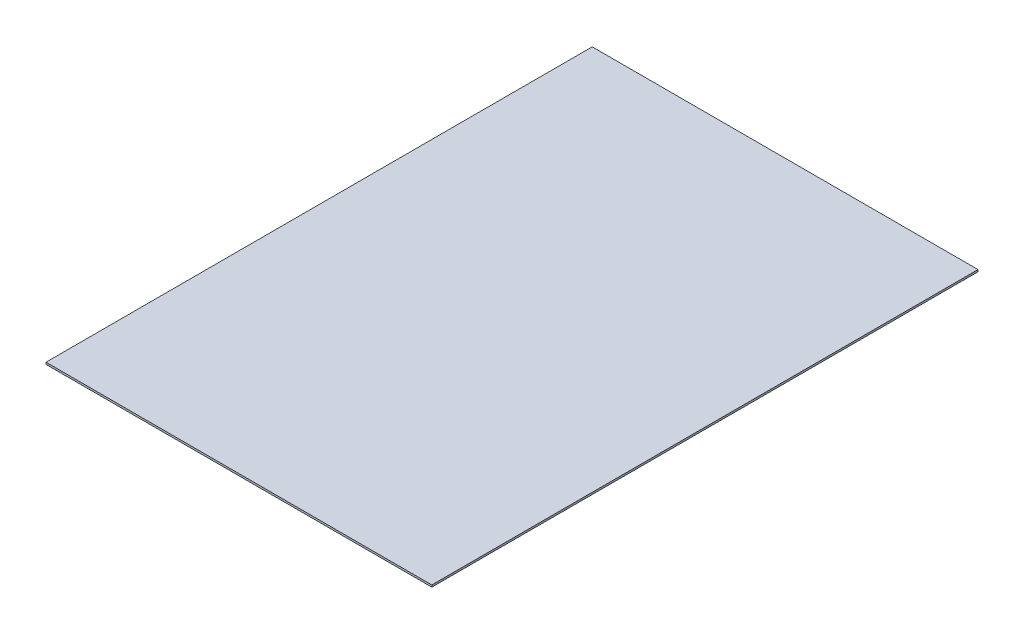
ISO-10303-21;
HEADER;
FILE_DESCRIPTION(('STEP AP214'),'2;1');
FILE_NAME('part.step','',(''),(''),'','','');
FILE_SCHEMA(('AUTOMOTIVE_DESIGN { 1 0 10303 214 1 1 1 1 }'));
ENDSEC;
DATA;
#1=APPLICATION_CONTEXT('core data for automotive mechanical design processes');
#2=APPLICATION_PROTOCOL_DEFINITION('international standard','automotive_design',2000,#1);
#3=PRODUCT_CONTEXT('',#1,'mechanical');
#4=PRODUCT('Part','Part','',(#3));
#5=PRODUCT_RELATED_PRODUCT_CATEGORY('part','',(#4));
#6=PRODUCT_DEFINITION_FORMATION('','',#4);
#7=PRODUCT_DEFINITION_CONTEXT('part definition',#1,'design');
#8=PRODUCT_DEFINITION('design','',#6,#7);
#9=PRODUCT_DEFINITION_SHAPE('','',#8);
#10=(LENGTH_UNIT() NAMED_UNIT(*) SI_UNIT(.MILLI.,.METRE.));
#11=(NAMED_UNIT(*) PLANE_ANGLE_UNIT() SI_UNIT($,.RADIAN.));
#12=(NAMED_UNIT(*) SI_UNIT($,.STERADIAN.) SOLID_ANGLE_UNIT());
#13=UNCERTAINTY_MEASURE_WITH_UNIT(LENGTH_MEASURE(1.E-05),#10,'distance_accuracy_value','');
#14=(GEOMETRIC_REPRESENTATION_CONTEXT(3) GLOBAL_UNCERTAINTY_ASSIGNED_CONTEXT((#13)) GLOBAL_UNIT_ASSIGNED_CONTEXT((#10,
#11,#12)) REPRESENTATION_CONTEXT('',''));
#15=CARTESIAN_POINT('',(0.,0.,0.));
#16=DIRECTION('',(0.,0.,1.));
#17=DIRECTION('',(1.,0.,0.));
#18=AXIS2_PLACEMENT_3D('',#15,#16,#17);
#19=CARTESIAN_POINT('',(297.,3.,420.5));
#20=DIRECTION('',(-1.,0.,0.));
#21=DIRECTION('',(0.,0.,1.));
#22=AXIS2_PLACEMENT_3D('',#19,#20,#21);
#23=PLANE('',#22);
#24=DIRECTION('',(0.,0.,-1.));
#25=VECTOR('',#24,1.);
#26=CARTESIAN_POINT('',(297.,0.,420.5));
#27=LINE('',#26,#25);
#28=CARTESIAN_POINT('',(297.,0.,420.5));
#29=VERTEX_POINT('',#28);
#30=CARTESIAN_POINT('',(297.,0.,-420.5));
#31=VERTEX_POINT('',#30);
#32=EDGE_CURVE('E96',#29,#31,#27,.T.);
#33=ORIENTED_EDGE('',*,*,#32,.T.);
#34=DIRECTION('',(0.,-1.,0.));
#35=VECTOR('',#34,1.);
#36=CARTESIAN_POINT('',(297.,3.,-420.5));
#37=LINE('',#36,#35);
#38=CARTESIAN_POINT('',(297.,3.,-420.5));
#39=VERTEX_POINT('',#38);
#40=EDGE_CURVE('E11',#39,#31,#37,.T.);
#41=ORIENTED_EDGE('',*,*,#40,.F.);
#42=DIRECTION('',(0.,0.,-1.));
#43=VECTOR('',#42,1.);
#44=CARTESIAN_POINT('',(297.,3.,420.5));
#45=LINE('',#44,#43);
#46=CARTESIAN_POINT('',(297.,3.,420.5));
#47=VERTEX_POINT('',#46);
#48=EDGE_CURVE('E84',#47,#39,#45,.T.);
#49=ORIENTED_EDGE('',*,*,#48,.F.);
#50=DIRECTION('',(0.,-1.,0.));
#51=VECTOR('',#50,1.);
#52=CARTESIAN_POINT('',(297.,3.,420.5));
#53=LINE('',#52,#51);
#54=EDGE_CURVE('E92',#47,#29,#53,.T.);
#55=ORIENTED_EDGE('',*,*,#54,.T.);
#56=EDGE_LOOP('',(#33,#41,#49,#55));
#57=FACE_BOUND('',#56,.T.);
#58=ADVANCED_FACE('F33',(#57),#23,.F.);
#59=CARTESIAN_POINT('',(-297.,3.,-420.5));
#60=DIRECTION('',(0.,0.,1.));
#61=DIRECTION('',(1.,0.,0.));
#62=AXIS2_PLACEMENT_3D('',#59,#60,#61);
#63=PLANE('',#62);
#64=DIRECTION('',(-1.,0.,0.));
#65=VECTOR('',#64,1.);
#66=CARTESIAN_POINT('',(-297.,0.,-420.5));
#67=LINE('',#66,#65);
#68=CARTESIAN_POINT('',(-297.,0.,-420.5));
#69=VERTEX_POINT('',#68);
#70=EDGE_CURVE('E88',#31,#69,#67,.T.);
#71=ORIENTED_EDGE('',*,*,#70,.T.);
#72=DIRECTION('',(0.,-1.,0.));
#73=VECTOR('',#72,1.);
#74=CARTESIAN_POINT('',(-297.,3.,-420.5));
#75=LINE('',#74,#73);
#76=CARTESIAN_POINT('',(-297.,3.,-420.5));
#77=VERTEX_POINT('',#76);
#78=EDGE_CURVE('E41',#77,#69,#75,.T.);
#79=ORIENTED_EDGE('',*,*,#78,.F.);
#80=DIRECTION('',(-1.,0.,0.));
#81=VECTOR('',#80,1.);
#82=CARTESIAN_POINT('',(-297.,3.,-420.5));
#83=LINE('',#82,#81);
#84=EDGE_CURVE('E79',#39,#77,#83,.T.);
#85=ORIENTED_EDGE('',*,*,#84,.F.);
#86=ORIENTED_EDGE('',*,*,#40,.T.);
#87=EDGE_LOOP('',(#71,#79,#85,#86));
#88=FACE_BOUND('',#87,.T.);
#89=ADVANCED_FACE('F87',(#88),#63,.F.);
#90=CARTESIAN_POINT('',(-297.,3.,420.5));
#91=DIRECTION('',(1.,0.,0.));
#92=DIRECTION('',(0.,0.,-1.));
#93=AXIS2_PLACEMENT_3D('',#90,#91,#92);
#94=PLANE('',#93);
#95=DIRECTION('',(0.,0.,1.));
#96=VECTOR('',#95,1.);
#97=CARTESIAN_POINT('',(-297.,0.,420.5));
#98=LINE('',#97,#96);
#99=CARTESIAN_POINT('',(-297.,0.,420.5));
#100=VERTEX_POINT('',#99);
#101=EDGE_CURVE('E66',#69,#100,#98,.T.);
#102=ORIENTED_EDGE('',*,*,#101,.T.);
#103=DIRECTION('',(0.,-1.,0.));
#104=VECTOR('',#103,1.);
#105=CARTESIAN_POINT('',(-297.,3.,420.5));
#106=LINE('',#105,#104);
#107=CARTESIAN_POINT('',(-297.,3.,420.5));
#108=VERTEX_POINT('',#107);
#109=EDGE_CURVE('E89',#108,#100,#106,.T.);
#110=ORIENTED_EDGE('',*,*,#109,.F.);
#111=DIRECTION('',(0.,0.,1.));
#112=VECTOR('',#111,1.);
#113=CARTESIAN_POINT('',(-297.,3.,420.5));
#114=LINE('',#113,#112);
#115=EDGE_CURVE('E82',#77,#108,#114,.T.);
#116=ORIENTED_EDGE('',*,*,#115,.F.);
#117=ORIENTED_EDGE('',*,*,#78,.T.);
#118=EDGE_LOOP('',(#102,#110,#116,#117));
#119=FACE_BOUND('',#118,.T.);
#120=ADVANCED_FACE('F90',(#119),#94,.F.);
#121=CARTESIAN_POINT('',(-297.,3.,420.5));
#122=DIRECTION('',(0.,0.,-1.));
#123=DIRECTION('',(-1.,0.,0.));
#124=AXIS2_PLACEMENT_3D('',#121,#122,#123);
#125=PLANE('',#124);
#126=DIRECTION('',(1.,0.,0.));
#127=VECTOR('',#126,1.);
#128=CARTESIAN_POINT('',(-297.,0.,420.5));
#129=LINE('',#128,#127);
#130=EDGE_CURVE('E72',#100,#29,#129,.T.);
#131=ORIENTED_EDGE('',*,*,#130,.T.);
#132=ORIENTED_EDGE('',*,*,#54,.F.);
#133=DIRECTION('',(1.,0.,0.));
#134=VECTOR('',#133,1.);
#135=CARTESIAN_POINT('',(-297.,3.,420.5));
#136=LINE('',#135,#134);
#137=EDGE_CURVE('E49',#108,#47,#136,.T.);
#138=ORIENTED_EDGE('',*,*,#137,.F.);
#139=ORIENTED_EDGE('',*,*,#109,.T.);
#140=EDGE_LOOP('',(#131,#132,#138,#139));
#141=FACE_BOUND('',#140,.T.);
#142=ADVANCED_FACE('F103',(#141),#125,.F.);
#143=CARTESIAN_POINT('',(0.,3.,0.));
#144=DIRECTION('',(0.,-1.,0.));
#145=DIRECTION('',(0.,0.,-1.));
#146=AXIS2_PLACEMENT_3D('',#143,#144,#145);
#147=PLANE('',#146);
#148=ORIENTED_EDGE('',*,*,#48,.T.);
#149=ORIENTED_EDGE('',*,*,#84,.T.);
#150=ORIENTED_EDGE('',*,*,#115,.T.);
#151=ORIENTED_EDGE('',*,*,#137,.T.);
#152=EDGE_LOOP('',(#148,#149,#150,#151));
#153=FACE_BOUND('',#152,.T.);
#154=ADVANCED_FACE('F80',(#153),#147,.F.);
#155=CARTESIAN_POINT('',(0.,0.,0.));
#156=DIRECTION('',(0.,-1.,0.));
#157=DIRECTION('',(0.,0.,-1.));
#158=AXIS2_PLACEMENT_3D('',#155,#156,#157);
#159=PLANE('',#158);
#160=ORIENTED_EDGE('',*,*,#32,.F.);
#161=ORIENTED_EDGE('',*,*,#130,.F.);
#162=ORIENTED_EDGE('',*,*,#101,.F.);
#163=ORIENTED_EDGE('',*,*,#70,.F.);
#164=EDGE_LOOP('',(#160,#161,#162,#163));
#165=FACE_BOUND('',#164,.T.);
#166=ADVANCED_FACE('F106',(#165),#159,.T.);
#167=CLOSED_SHELL('',(#58,#89,#120,#142,#154,#166));
#168=MANIFOLD_SOLID_BREP('B2',#167);
#169=ADVANCED_BREP_SHAPE_REPRESENTATION('',(#18,#168),#14);
#170=SHAPE_DEFINITION_REPRESENTATION(#9,#169);
ENDSEC;
END-ISO-10303-21;
